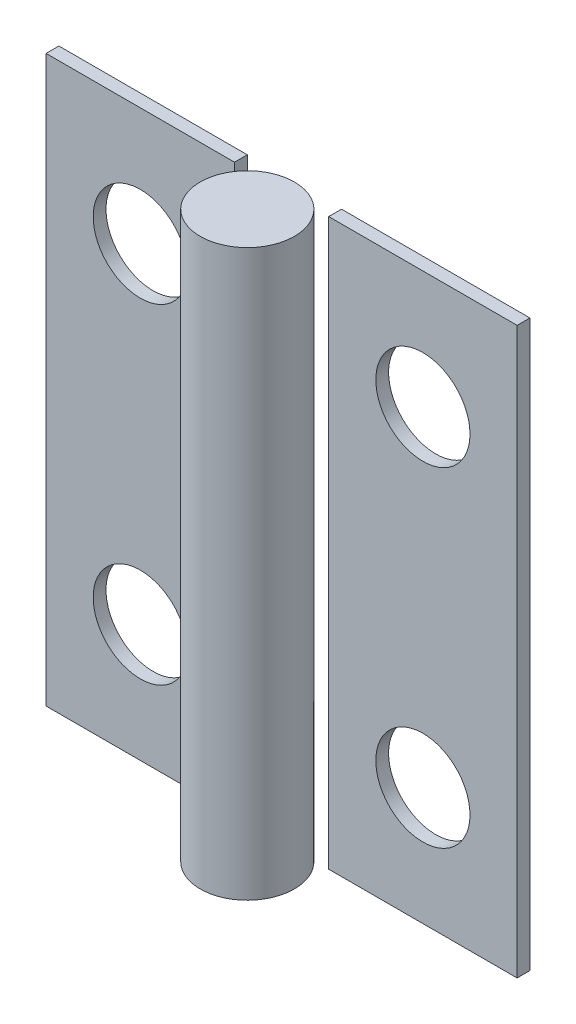
ISO-10303-21;
HEADER;
FILE_DESCRIPTION(('STEP AP214'),'2;1');
FILE_NAME('part.step','',(''),(''),'','','');
FILE_SCHEMA(('AUTOMOTIVE_DESIGN { 1 0 10303 214 1 1 1 1 }'));
ENDSEC;
DATA;
#1=APPLICATION_CONTEXT('core data for automotive mechanical design processes');
#2=APPLICATION_PROTOCOL_DEFINITION('international standard','automotive_design',2000,#1);
#3=PRODUCT_CONTEXT('',#1,'mechanical');
#4=PRODUCT('Part','Part','',(#3));
#5=PRODUCT_RELATED_PRODUCT_CATEGORY('part','',(#4));
#6=PRODUCT_DEFINITION_FORMATION('','',#4);
#7=PRODUCT_DEFINITION_CONTEXT('part definition',#1,'design');
#8=PRODUCT_DEFINITION('design','',#6,#7);
#9=PRODUCT_DEFINITION_SHAPE('','',#8);
#10=(LENGTH_UNIT() NAMED_UNIT(*) SI_UNIT(.MILLI.,.METRE.));
#11=(NAMED_UNIT(*) PLANE_ANGLE_UNIT() SI_UNIT($,.RADIAN.));
#12=(NAMED_UNIT(*) SI_UNIT($,.STERADIAN.) SOLID_ANGLE_UNIT());
#13=UNCERTAINTY_MEASURE_WITH_UNIT(LENGTH_MEASURE(1.E-05),#10,'distance_accuracy_value','');
#14=(GEOMETRIC_REPRESENTATION_CONTEXT(3) GLOBAL_UNCERTAINTY_ASSIGNED_CONTEXT((#13)) GLOBAL_UNIT_ASSIGNED_CONTEXT((#10,
#11,#12)) REPRESENTATION_CONTEXT('',''));
#15=CARTESIAN_POINT('',(0.,0.,0.));
#16=DIRECTION('',(0.,0.,1.));
#17=DIRECTION('',(1.,0.,0.));
#18=AXIS2_PLACEMENT_3D('',#15,#16,#17);
#19=CARTESIAN_POINT('',(0.,19.05,1.5875));
#20=DIRECTION('',(0.,-1.,0.));
#21=DIRECTION('',(0.,0.,-1.));
#22=AXIS2_PLACEMENT_3D('',#19,#20,#21);
#23=CYLINDRICAL_SURFACE('',#22,1.5875);
#24=CARTESIAN_POINT('',(0.,19.05,1.5875));
#25=DIRECTION('',(0.,1.,0.));
#26=DIRECTION('',(0.,0.,1.));
#27=AXIS2_PLACEMENT_3D('',#24,#25,#26);
#28=CIRCLE('',#27,1.5875);
#29=CARTESIAN_POINT('',(0.,19.05,0.));
#30=VERTEX_POINT('',#29);
#31=EDGE_CURVE('E11',#30,#30,#28,.T.);
#32=CARTESIAN_POINT('',(0.,0.,1.5875));
#33=DIRECTION('',(0.,1.,0.));
#34=DIRECTION('',(0.,0.,1.));
#35=AXIS2_PLACEMENT_3D('',#32,#33,#34);
#36=CIRCLE('',#35,1.5875);
#37=CARTESIAN_POINT('',(0.,0.,0.));
#38=VERTEX_POINT('',#37);
#39=EDGE_CURVE('E49',#38,#38,#36,.T.);
#40=CARTESIAN_POINT('',(0.,19.05,0.));
#41=CARTESIAN_POINT('',(0.,18.8515625,0.));
#42=CARTESIAN_POINT('',(0.,18.653125,0.));
#43=CARTESIAN_POINT('',(0.,18.25625,0.));
#44=CARTESIAN_POINT('',(0.,18.0578125,0.));
#45=CARTESIAN_POINT('',(0.,17.6609375,0.));
#46=CARTESIAN_POINT('',(0.,17.4625,0.));
#47=CARTESIAN_POINT('',(0.,17.065625,0.));
#48=CARTESIAN_POINT('',(0.,16.8671875,0.));
#49=CARTESIAN_POINT('',(0.,16.4703125,0.));
#50=CARTESIAN_POINT('',(0.,16.271875,0.));
#51=CARTESIAN_POINT('',(0.,15.875,0.));
#52=CARTESIAN_POINT('',(0.,15.6765625,0.));
#53=CARTESIAN_POINT('',(0.,15.2796875,0.));
#54=CARTESIAN_POINT('',(0.,15.08125,0.));
#55=CARTESIAN_POINT('',(0.,14.684375,0.));
#56=CARTESIAN_POINT('',(0.,14.4859375,0.));
#57=CARTESIAN_POINT('',(0.,14.0890625,0.));
#58=CARTESIAN_POINT('',(0.,13.890625,0.));
#59=CARTESIAN_POINT('',(0.,13.49375,0.));
#60=CARTESIAN_POINT('',(0.,13.2953125,0.));
#61=CARTESIAN_POINT('',(0.,12.8984375,0.));
#62=CARTESIAN_POINT('',(0.,12.7,0.));
#63=CARTESIAN_POINT('',(0.,12.303125,0.));
#64=CARTESIAN_POINT('',(0.,12.1046875,0.));
#65=CARTESIAN_POINT('',(0.,11.7078125,0.));
#66=CARTESIAN_POINT('',(0.,11.509375,0.));
#67=CARTESIAN_POINT('',(0.,11.1125,0.));
#68=CARTESIAN_POINT('',(0.,10.9140625,0.));
#69=CARTESIAN_POINT('',(0.,10.5171875,0.));
#70=CARTESIAN_POINT('',(0.,10.31875,0.));
#71=CARTESIAN_POINT('',(0.,9.921875,0.));
#72=CARTESIAN_POINT('',(0.,9.7234375,0.));
#73=CARTESIAN_POINT('',(0.,9.3265625,0.));
#74=CARTESIAN_POINT('',(0.,9.128125,0.));
#75=CARTESIAN_POINT('',(0.,8.73125,0.));
#76=CARTESIAN_POINT('',(0.,8.5328125,0.));
#77=CARTESIAN_POINT('',(0.,8.1359375,0.));
#78=CARTESIAN_POINT('',(0.,7.9375,0.));
#79=CARTESIAN_POINT('',(0.,7.540625,0.));
#80=CARTESIAN_POINT('',(0.,7.3421875,0.));
#81=CARTESIAN_POINT('',(0.,6.9453125,0.));
#82=CARTESIAN_POINT('',(0.,6.746875,0.));
#83=CARTESIAN_POINT('',(0.,6.35,0.));
#84=CARTESIAN_POINT('',(0.,6.1515625,0.));
#85=CARTESIAN_POINT('',(0.,5.7546875,0.));
#86=CARTESIAN_POINT('',(0.,5.55625,0.));
#87=CARTESIAN_POINT('',(0.,5.159375,0.));
#88=CARTESIAN_POINT('',(0.,4.9609375,0.));
#89=CARTESIAN_POINT('',(0.,4.5640625,0.));
#90=CARTESIAN_POINT('',(0.,4.365625,0.));
#91=CARTESIAN_POINT('',(0.,3.96875,0.));
#92=CARTESIAN_POINT('',(0.,3.7703125,0.));
#93=CARTESIAN_POINT('',(0.,3.3734375,0.));
#94=CARTESIAN_POINT('',(0.,3.175,0.));
#95=CARTESIAN_POINT('',(0.,2.778125,0.));
#96=CARTESIAN_POINT('',(0.,2.5796875,0.));
#97=CARTESIAN_POINT('',(0.,2.1828125,0.));
#98=CARTESIAN_POINT('',(0.,1.984375,0.));
#99=CARTESIAN_POINT('',(0.,1.5875,0.));
#100=CARTESIAN_POINT('',(0.,1.3890625,0.));
#101=CARTESIAN_POINT('',(0.,0.992187500000001,0.));
#102=CARTESIAN_POINT('',(0.,0.793750000000001,0.));
#103=CARTESIAN_POINT('',(0.,0.396875,0.));
#104=CARTESIAN_POINT('',(0.,0.1984375,0.));
#105=CARTESIAN_POINT('',(0.,0.,0.));
#106=B_SPLINE_CURVE_WITH_KNOTS('',3,(#40,#41,#42,#43,#44,#45,#46,#47,#48,#49,#50,#51,#52,#53,
#54,#55,#56,#57,#58,#59,#60,#61,#62,#63,#64,#65,#66,#67,#68,#69,#70,#71,#72,#73,#74,#75,#76,#77,
#78,#79,#80,#81,#82,#83,#84,#85,#86,#87,#88,#89,#90,#91,#92,#93,#94,#95,#96,#97,#98,#99,#100,
#101,#102,#103,#104,#105),.UNSPECIFIED.,.F.,.F.,(4,2,2,2,2,2,2,2,2,2,2,2,2,2,2,2,2,2,2,2,2,2,2,
2,2,2,2,2,2,2,2,2,4),(0.,0.595312499999997,1.190625,1.7859375,2.38125,2.9765625,3.571875,
4.1671875,4.7625,5.3578125,5.953125,6.5484375,7.14375,7.7390625,8.334375,8.9296875,9.525,
10.1203125,10.715625,11.3109375,11.90625,12.5015625,13.096875,13.6921875,14.2875,14.8828125,
15.478125,16.0734375,16.66875,17.2640625,17.859375,18.4546875,19.05),.UNSPECIFIED.);
#107=EDGE_CURVE('BSEAM46',#30,#38,#106,.T.);
#108=ORIENTED_EDGE('',*,*,#31,.F.);
#109=ORIENTED_EDGE('',*,*,#39,.T.);
#110=ORIENTED_EDGE('',*,*,#107,.T.);
#111=ORIENTED_EDGE('',*,*,#107,.F.);
#112=EDGE_LOOP('',(#108,#110,#109,#111));
#113=FACE_BOUND('',#112,.T.);
#114=ADVANCED_FACE('F46',(#113),#23,.T.);
#115=CARTESIAN_POINT('',(0.,19.05,1.5875));
#116=DIRECTION('',(0.,1.,0.));
#117=DIRECTION('',(0.,0.,1.));
#118=AXIS2_PLACEMENT_3D('',#115,#116,#117);
#119=PLANE('',#118);
#120=ORIENTED_EDGE('',*,*,#31,.T.);
#121=EDGE_LOOP('',(#120));
#122=FACE_BOUND('',#121,.T.);
#123=ADVANCED_FACE('F61',(#122),#119,.T.);
#124=CARTESIAN_POINT('',(0.,0.,1.5875));
#125=DIRECTION('',(0.,1.,0.));
#126=DIRECTION('',(0.,0.,1.));
#127=AXIS2_PLACEMENT_3D('',#124,#125,#126);
#128=PLANE('',#127);
#129=ORIENTED_EDGE('',*,*,#39,.F.);
#130=EDGE_LOOP('',(#129));
#131=FACE_BOUND('',#130,.T.);
#132=ADVANCED_FACE('F59',(#131),#128,.F.);
#133=CLOSED_SHELL('',(#114,#123,#132));
#134=MANIFOLD_SOLID_BREP('B2',#133);
#135=CARTESIAN_POINT('',(0.,0.,0.4318));
#136=DIRECTION('',(0.,0.,1.));
#137=DIRECTION('',(1.,0.,0.));
#138=AXIS2_PLACEMENT_3D('',#135,#136,#137);
#139=PLANE('',#138);
#140=CARTESIAN_POINT('',(4.7625,3.96875,0.4318));
#141=DIRECTION('',(0.,0.,1.));
#142=DIRECTION('',(1.,0.,0.));
#143=AXIS2_PLACEMENT_3D('',#140,#141,#142);
#144=CIRCLE('',#143,1.5875);
#145=CARTESIAN_POINT('',(6.35,3.96875,0.4318));
#146=VERTEX_POINT('',#145);
#147=EDGE_CURVE('E163',#146,#146,#144,.T.);
#148=ORIENTED_EDGE('',*,*,#147,.F.);
#149=EDGE_LOOP('',(#148));
#150=FACE_BOUND('',#149,.T.);
#151=DIRECTION('',(0.,1.,0.));
#152=VECTOR('',#151,1.);
#153=CARTESIAN_POINT('',(7.9375,19.05,0.4318));
#154=LINE('',#153,#152);
#155=CARTESIAN_POINT('',(7.9375,0.,0.4318));
#156=VERTEX_POINT('',#155);
#157=CARTESIAN_POINT('',(7.9375,19.05,0.4318));
#158=VERTEX_POINT('',#157);
#159=EDGE_CURVE('E148',#156,#158,#154,.T.);
#160=ORIENTED_EDGE('',*,*,#159,.T.);
#161=DIRECTION('',(-1.,0.,0.));
#162=VECTOR('',#161,1.);
#163=CARTESIAN_POINT('',(1.5875,19.05,0.4318));
#164=LINE('',#163,#162);
#165=CARTESIAN_POINT('',(1.5875,19.05,0.4318));
#166=VERTEX_POINT('',#165);
#167=EDGE_CURVE('E143',#158,#166,#164,.T.);
#168=ORIENTED_EDGE('',*,*,#167,.T.);
#169=DIRECTION('',(0.,-1.,0.));
#170=VECTOR('',#169,1.);
#171=CARTESIAN_POINT('',(1.5875,19.05,0.4318));
#172=LINE('',#171,#170);
#173=CARTESIAN_POINT('',(1.5875,0.,0.4318));
#174=VERTEX_POINT('',#173);
#175=EDGE_CURVE('E146',#166,#174,#172,.T.);
#176=ORIENTED_EDGE('',*,*,#175,.T.);
#177=DIRECTION('',(1.,0.,0.));
#178=VECTOR('',#177,1.);
#179=CARTESIAN_POINT('',(1.5875,0.,0.4318));
#180=LINE('',#179,#178);
#181=EDGE_CURVE('E113',#174,#156,#180,.T.);
#182=ORIENTED_EDGE('',*,*,#181,.T.);
#183=EDGE_LOOP('',(#160,#168,#176,#182));
#184=FACE_BOUND('',#183,.T.);
#185=CARTESIAN_POINT('',(4.7625,15.08125,0.4318));
#186=DIRECTION('',(0.,0.,1.));
#187=DIRECTION('',(1.,0.,0.));
#188=AXIS2_PLACEMENT_3D('',#185,#186,#187);
#189=CIRCLE('',#188,1.5875);
#190=CARTESIAN_POINT('',(6.35,15.08125,0.4318));
#191=VERTEX_POINT('',#190);
#192=EDGE_CURVE('E178',#191,#191,#189,.T.);
#193=ORIENTED_EDGE('',*,*,#192,.F.);
#194=EDGE_LOOP('',(#193));
#195=FACE_BOUND('',#194,.T.);
#196=ADVANCED_FACE('F96',(#150,#184,#195),#139,.T.);
#197=CARTESIAN_POINT('',(0.,0.,0.));
#198=DIRECTION('',(0.,0.,1.));
#199=DIRECTION('',(1.,0.,0.));
#200=AXIS2_PLACEMENT_3D('',#197,#198,#199);
#201=PLANE('',#200);
#202=DIRECTION('',(0.,1.,0.));
#203=VECTOR('',#202,1.);
#204=CARTESIAN_POINT('',(7.9375,19.05,0.));
#205=LINE('',#204,#203);
#206=CARTESIAN_POINT('',(7.9375,0.,0.));
#207=VERTEX_POINT('',#206);
#208=CARTESIAN_POINT('',(7.9375,19.05,0.));
#209=VERTEX_POINT('',#208);
#210=EDGE_CURVE('E160',#207,#209,#205,.T.);
#211=ORIENTED_EDGE('',*,*,#210,.F.);
#212=DIRECTION('',(1.,0.,0.));
#213=VECTOR('',#212,1.);
#214=CARTESIAN_POINT('',(1.5875,0.,0.));
#215=LINE('',#214,#213);
#216=CARTESIAN_POINT('',(1.5875,0.,0.));
#217=VERTEX_POINT('',#216);
#218=EDGE_CURVE('E136',#217,#207,#215,.T.);
#219=ORIENTED_EDGE('',*,*,#218,.F.);
#220=DIRECTION('',(0.,-1.,0.));
#221=VECTOR('',#220,1.);
#222=CARTESIAN_POINT('',(1.5875,19.05,0.));
#223=LINE('',#222,#221);
#224=CARTESIAN_POINT('',(1.5875,19.05,0.));
#225=VERTEX_POINT('',#224);
#226=EDGE_CURVE('E130',#225,#217,#223,.T.);
#227=ORIENTED_EDGE('',*,*,#226,.F.);
#228=DIRECTION('',(-1.,0.,0.));
#229=VECTOR('',#228,1.);
#230=CARTESIAN_POINT('',(1.5875,19.05,0.));
#231=LINE('',#230,#229);
#232=EDGE_CURVE('E152',#209,#225,#231,.T.);
#233=ORIENTED_EDGE('',*,*,#232,.F.);
#234=EDGE_LOOP('',(#211,#219,#227,#233));
#235=FACE_BOUND('',#234,.T.);
#236=CARTESIAN_POINT('',(4.7625,3.96875,0.));
#237=DIRECTION('',(0.,0.,1.));
#238=DIRECTION('',(1.,0.,0.));
#239=AXIS2_PLACEMENT_3D('',#236,#237,#238);
#240=CIRCLE('',#239,1.5875);
#241=CARTESIAN_POINT('',(6.35,3.96875,0.));
#242=VERTEX_POINT('',#241);
#243=EDGE_CURVE('E175',#242,#242,#240,.T.);
#244=ORIENTED_EDGE('',*,*,#243,.T.);
#245=EDGE_LOOP('',(#244));
#246=FACE_BOUND('',#245,.T.);
#247=CARTESIAN_POINT('',(4.7625,15.08125,0.));
#248=DIRECTION('',(0.,0.,1.));
#249=DIRECTION('',(1.,0.,0.));
#250=AXIS2_PLACEMENT_3D('',#247,#248,#249);
#251=CIRCLE('',#250,1.5875);
#252=CARTESIAN_POINT('',(6.35,15.08125,0.));
#253=VERTEX_POINT('',#252);
#254=EDGE_CURVE('E181',#253,#253,#251,.T.);
#255=ORIENTED_EDGE('',*,*,#254,.T.);
#256=EDGE_LOOP('',(#255));
#257=FACE_BOUND('',#256,.T.);
#258=ADVANCED_FACE('F171',(#235,#246,#257),#201,.F.);
#259=CARTESIAN_POINT('',(7.9375,19.05,0.4318));
#260=DIRECTION('',(-1.,0.,0.));
#261=DIRECTION('',(0.,-1.,0.));
#262=AXIS2_PLACEMENT_3D('',#259,#260,#261);
#263=PLANE('',#262);
#264=ORIENTED_EDGE('',*,*,#210,.T.);
#265=DIRECTION('',(0.,0.,-1.));
#266=VECTOR('',#265,1.);
#267=CARTESIAN_POINT('',(7.9375,19.05,0.4318));
#268=LINE('',#267,#266);
#269=EDGE_CURVE('E44',#158,#209,#268,.T.);
#270=ORIENTED_EDGE('',*,*,#269,.F.);
#271=ORIENTED_EDGE('',*,*,#159,.F.);
#272=DIRECTION('',(0.,0.,-1.));
#273=VECTOR('',#272,1.);
#274=CARTESIAN_POINT('',(7.9375,0.,0.4318));
#275=LINE('',#274,#273);
#276=EDGE_CURVE('E156',#156,#207,#275,.T.);
#277=ORIENTED_EDGE('',*,*,#276,.T.);
#278=EDGE_LOOP('',(#264,#270,#271,#277));
#279=FACE_BOUND('',#278,.T.);
#280=ADVANCED_FACE('F98',(#279),#263,.F.);
#281=CARTESIAN_POINT('',(1.5875,19.05,0.4318));
#282=DIRECTION('',(0.,-1.,0.));
#283=DIRECTION('',(0.,0.,-1.));
#284=AXIS2_PLACEMENT_3D('',#281,#282,#283);
#285=PLANE('',#284);
#286=ORIENTED_EDGE('',*,*,#232,.T.);
#287=DIRECTION('',(0.,0.,-1.));
#288=VECTOR('',#287,1.);
#289=CARTESIAN_POINT('',(1.5875,19.05,0.4318));
#290=LINE('',#289,#288);
#291=EDGE_CURVE('E105',#166,#225,#290,.T.);
#292=ORIENTED_EDGE('',*,*,#291,.F.);
#293=ORIENTED_EDGE('',*,*,#167,.F.);
#294=ORIENTED_EDGE('',*,*,#269,.T.);
#295=EDGE_LOOP('',(#286,#292,#293,#294));
#296=FACE_BOUND('',#295,.T.);
#297=ADVANCED_FACE('F151',(#296),#285,.F.);
#298=CARTESIAN_POINT('',(1.5875,19.05,0.4318));
#299=DIRECTION('',(1.,0.,0.));
#300=DIRECTION('',(0.,0.,-1.));
#301=AXIS2_PLACEMENT_3D('',#298,#299,#300);
#302=PLANE('',#301);
#303=ORIENTED_EDGE('',*,*,#226,.T.);
#304=DIRECTION('',(0.,0.,-1.));
#305=VECTOR('',#304,1.);
#306=CARTESIAN_POINT('',(1.5875,0.,0.4318));
#307=LINE('',#306,#305);
#308=EDGE_CURVE('E153',#174,#217,#307,.T.);
#309=ORIENTED_EDGE('',*,*,#308,.F.);
#310=ORIENTED_EDGE('',*,*,#175,.F.);
#311=ORIENTED_EDGE('',*,*,#291,.T.);
#312=EDGE_LOOP('',(#303,#309,#310,#311));
#313=FACE_BOUND('',#312,.T.);
#314=ADVANCED_FACE('F154',(#313),#302,.F.);
#315=CARTESIAN_POINT('',(1.5875,0.,0.4318));
#316=DIRECTION('',(0.,1.,0.));
#317=DIRECTION('',(-1.,0.,0.));
#318=AXIS2_PLACEMENT_3D('',#315,#316,#317);
#319=PLANE('',#318);
#320=ORIENTED_EDGE('',*,*,#218,.T.);
#321=ORIENTED_EDGE('',*,*,#276,.F.);
#322=ORIENTED_EDGE('',*,*,#181,.F.);
#323=ORIENTED_EDGE('',*,*,#308,.T.);
#324=EDGE_LOOP('',(#320,#321,#322,#323));
#325=FACE_BOUND('',#324,.T.);
#326=ADVANCED_FACE('F168',(#325),#319,.F.);
#327=CARTESIAN_POINT('',(4.7625,3.96875,0.4318));
#328=DIRECTION('',(0.,0.,-1.));
#329=DIRECTION('',(-1.,0.,0.));
#330=AXIS2_PLACEMENT_3D('',#327,#328,#329);
#331=CYLINDRICAL_SURFACE('',#330,1.5875);
#332=ORIENTED_EDGE('',*,*,#147,.T.);
#333=EDGE_LOOP('',(#332));
#334=FACE_BOUND('',#333,.T.);
#335=ORIENTED_EDGE('',*,*,#243,.F.);
#336=EDGE_LOOP('',(#335));
#337=FACE_BOUND('',#336,.T.);
#338=ADVANCED_FACE('F198',(#334,#337),#331,.F.);
#339=CARTESIAN_POINT('',(4.7625,15.08125,0.4318));
#340=DIRECTION('',(0.,0.,-1.));
#341=DIRECTION('',(-1.,0.,0.));
#342=AXIS2_PLACEMENT_3D('',#339,#340,#341);
#343=CYLINDRICAL_SURFACE('',#342,1.5875);
#344=ORIENTED_EDGE('',*,*,#192,.T.);
#345=EDGE_LOOP('',(#344));
#346=FACE_BOUND('',#345,.T.);
#347=ORIENTED_EDGE('',*,*,#254,.F.);
#348=EDGE_LOOP('',(#347));
#349=FACE_BOUND('',#348,.T.);
#350=ADVANCED_FACE('F187',(#346,#349),#343,.F.);
#351=CLOSED_SHELL('',(#196,#258,#280,#297,#314,#326,#338,#350));
#352=MANIFOLD_SOLID_BREP('B6',#351);
#353=CARTESIAN_POINT('',(0.,0.,0.4318));
#354=DIRECTION('',(0.,0.,-1.));
#355=DIRECTION('',(-1.,0.,0.));
#356=AXIS2_PLACEMENT_3D('',#353,#354,#355);
#357=PLANE('',#356);
#358=DIRECTION('',(0.,-1.,0.));
#359=VECTOR('',#358,1.);
#360=CARTESIAN_POINT('',(-7.93750000000001,0.,0.4318));
#361=LINE('',#360,#359);
#362=CARTESIAN_POINT('',(-7.9375,19.05,0.4318));
#363=VERTEX_POINT('',#362);
#364=CARTESIAN_POINT('',(-7.93750000000001,0.,0.4318));
#365=VERTEX_POINT('',#364);
#366=EDGE_CURVE('E314',#363,#365,#361,.T.);
#367=ORIENTED_EDGE('',*,*,#366,.T.);
#368=DIRECTION('',(1.,0.,0.));
#369=VECTOR('',#368,1.);
#370=CARTESIAN_POINT('',(-7.93750000000001,0.,0.4318));
#371=LINE('',#370,#369);
#372=CARTESIAN_POINT('',(-1.5875,0.,0.4318));
#373=VERTEX_POINT('',#372);
#374=EDGE_CURVE('E309',#365,#373,#371,.T.);
#375=ORIENTED_EDGE('',*,*,#374,.T.);
#376=DIRECTION('',(0.,1.,0.));
#377=VECTOR('',#376,1.);
#378=CARTESIAN_POINT('',(-1.5875,0.,0.4318));
#379=LINE('',#378,#377);
#380=CARTESIAN_POINT('',(-1.5875,19.05,0.4318));
#381=VERTEX_POINT('',#380);
#382=EDGE_CURVE('E312',#373,#381,#379,.T.);
#383=ORIENTED_EDGE('',*,*,#382,.T.);
#384=DIRECTION('',(-1.,0.,0.));
#385=VECTOR('',#384,1.);
#386=CARTESIAN_POINT('',(-7.9375,19.05,0.4318));
#387=LINE('',#386,#385);
#388=EDGE_CURVE('E279',#381,#363,#387,.T.);
#389=ORIENTED_EDGE('',*,*,#388,.T.);
#390=EDGE_LOOP('',(#367,#375,#383,#389));
#391=FACE_BOUND('',#390,.T.);
#392=CARTESIAN_POINT('',(-4.7625,15.08125,0.4318));
#393=DIRECTION('',(0.,0.,1.));
#394=DIRECTION('',(1.,0.,0.));
#395=AXIS2_PLACEMENT_3D('',#392,#393,#394);
#396=CIRCLE('',#395,1.5875);
#397=CARTESIAN_POINT('',(-3.175,15.08125,0.4318));
#398=VERTEX_POINT('',#397);
#399=EDGE_CURVE('E329',#398,#398,#396,.T.);
#400=ORIENTED_EDGE('',*,*,#399,.F.);
#401=EDGE_LOOP('',(#400));
#402=FACE_BOUND('',#401,.T.);
#403=CARTESIAN_POINT('',(-4.7625,3.96875,0.4318));
#404=DIRECTION('',(0.,0.,1.));
#405=DIRECTION('',(1.,0.,0.));
#406=AXIS2_PLACEMENT_3D('',#403,#404,#405);
#407=CIRCLE('',#406,1.5875);
#408=CARTESIAN_POINT('',(-3.175,3.96875,0.4318));
#409=VERTEX_POINT('',#408);
#410=EDGE_CURVE('E344',#409,#409,#407,.T.);
#411=ORIENTED_EDGE('',*,*,#410,.F.);
#412=EDGE_LOOP('',(#411));
#413=FACE_BOUND('',#412,.T.);
#414=ADVANCED_FACE('F262',(#391,#402,#413),#357,.F.);
#415=CARTESIAN_POINT('',(0.,0.,0.));
#416=DIRECTION('',(0.,0.,-1.));
#417=DIRECTION('',(-1.,0.,0.));
#418=AXIS2_PLACEMENT_3D('',#415,#416,#417);
#419=PLANE('',#418);
#420=CARTESIAN_POINT('',(-4.7625,15.08125,0.));
#421=DIRECTION('',(0.,0.,1.));
#422=DIRECTION('',(1.,0.,0.));
#423=AXIS2_PLACEMENT_3D('',#420,#421,#422);
#424=CIRCLE('',#423,1.5875);
#425=CARTESIAN_POINT('',(-3.175,15.08125,0.));
#426=VERTEX_POINT('',#425);
#427=EDGE_CURVE('E341',#426,#426,#424,.T.);
#428=ORIENTED_EDGE('',*,*,#427,.T.);
#429=EDGE_LOOP('',(#428));
#430=FACE_BOUND('',#429,.T.);
#431=DIRECTION('',(0.,-1.,0.));
#432=VECTOR('',#431,1.);
#433=CARTESIAN_POINT('',(-7.93750000000001,0.,0.));
#434=LINE('',#433,#432);
#435=CARTESIAN_POINT('',(-7.9375,19.05,0.));
#436=VERTEX_POINT('',#435);
#437=CARTESIAN_POINT('',(-7.93750000000001,0.,0.));
#438=VERTEX_POINT('',#437);
#439=EDGE_CURVE('E326',#436,#438,#434,.T.);
#440=ORIENTED_EDGE('',*,*,#439,.F.);
#441=DIRECTION('',(-1.,0.,0.));
#442=VECTOR('',#441,1.);
#443=CARTESIAN_POINT('',(-7.9375,19.05,0.));
#444=LINE('',#443,#442);
#445=CARTESIAN_POINT('',(-1.5875,19.05,0.));
#446=VERTEX_POINT('',#445);
#447=EDGE_CURVE('E302',#446,#436,#444,.T.);
#448=ORIENTED_EDGE('',*,*,#447,.F.);
#449=DIRECTION('',(0.,1.,0.));
#450=VECTOR('',#449,1.);
#451=CARTESIAN_POINT('',(-1.5875,0.,0.));
#452=LINE('',#451,#450);
#453=CARTESIAN_POINT('',(-1.5875,0.,0.));
#454=VERTEX_POINT('',#453);
#455=EDGE_CURVE('E296',#454,#446,#452,.T.);
#456=ORIENTED_EDGE('',*,*,#455,.F.);
#457=DIRECTION('',(1.,0.,0.));
#458=VECTOR('',#457,1.);
#459=CARTESIAN_POINT('',(-7.93750000000001,0.,0.));
#460=LINE('',#459,#458);
#461=EDGE_CURVE('E318',#438,#454,#460,.T.);
#462=ORIENTED_EDGE('',*,*,#461,.F.);
#463=EDGE_LOOP('',(#440,#448,#456,#462));
#464=FACE_BOUND('',#463,.T.);
#465=CARTESIAN_POINT('',(-4.7625,3.96875,0.));
#466=DIRECTION('',(0.,0.,1.));
#467=DIRECTION('',(1.,0.,0.));
#468=AXIS2_PLACEMENT_3D('',#465,#466,#467);
#469=CIRCLE('',#468,1.5875);
#470=CARTESIAN_POINT('',(-3.175,3.96875,0.));
#471=VERTEX_POINT('',#470);
#472=EDGE_CURVE('E347',#471,#471,#469,.T.);
#473=ORIENTED_EDGE('',*,*,#472,.T.);
#474=EDGE_LOOP('',(#473));
#475=FACE_BOUND('',#474,.T.);
#476=ADVANCED_FACE('F337',(#430,#464,#475),#419,.T.);
#477=CARTESIAN_POINT('',(-7.93750000000001,0.,0.4318));
#478=DIRECTION('',(1.,0.,0.));
#479=DIRECTION('',(0.,1.,0.));
#480=AXIS2_PLACEMENT_3D('',#477,#478,#479);
#481=PLANE('',#480);
#482=ORIENTED_EDGE('',*,*,#439,.T.);
#483=DIRECTION('',(0.,0.,-1.));
#484=VECTOR('',#483,1.);
#485=CARTESIAN_POINT('',(-7.93750000000001,0.,0.4318));
#486=LINE('',#485,#484);
#487=EDGE_CURVE('E94',#365,#438,#486,.T.);
#488=ORIENTED_EDGE('',*,*,#487,.F.);
#489=ORIENTED_EDGE('',*,*,#366,.F.);
#490=DIRECTION('',(0.,0.,-1.));
#491=VECTOR('',#490,1.);
#492=CARTESIAN_POINT('',(-7.9375,19.05,0.4318));
#493=LINE('',#492,#491);
#494=EDGE_CURVE('E322',#363,#436,#493,.T.);
#495=ORIENTED_EDGE('',*,*,#494,.T.);
#496=EDGE_LOOP('',(#482,#488,#489,#495));
#497=FACE_BOUND('',#496,.T.);
#498=ADVANCED_FACE('F264',(#497),#481,.F.);
#499=CARTESIAN_POINT('',(-7.93750000000001,0.,0.4318));
#500=DIRECTION('',(0.,1.,0.));
#501=DIRECTION('',(-1.,0.,0.));
#502=AXIS2_PLACEMENT_3D('',#499,#500,#501);
#503=PLANE('',#502);
#504=ORIENTED_EDGE('',*,*,#461,.T.);
#505=DIRECTION('',(0.,0.,-1.));
#506=VECTOR('',#505,1.);
#507=CARTESIAN_POINT('',(-1.5875,0.,0.4318));
#508=LINE('',#507,#506);
#509=EDGE_CURVE('E271',#373,#454,#508,.T.);
#510=ORIENTED_EDGE('',*,*,#509,.F.);
#511=ORIENTED_EDGE('',*,*,#374,.F.);
#512=ORIENTED_EDGE('',*,*,#487,.T.);
#513=EDGE_LOOP('',(#504,#510,#511,#512));
#514=FACE_BOUND('',#513,.T.);
#515=ADVANCED_FACE('F317',(#514),#503,.F.);
#516=CARTESIAN_POINT('',(-1.5875,0.,0.4318));
#517=DIRECTION('',(-1.,0.,0.));
#518=DIRECTION('',(0.,-1.,0.));
#519=AXIS2_PLACEMENT_3D('',#516,#517,#518);
#520=PLANE('',#519);
#521=ORIENTED_EDGE('',*,*,#455,.T.);
#522=DIRECTION('',(0.,0.,-1.));
#523=VECTOR('',#522,1.);
#524=CARTESIAN_POINT('',(-1.5875,19.05,0.4318));
#525=LINE('',#524,#523);
#526=EDGE_CURVE('E319',#381,#446,#525,.T.);
#527=ORIENTED_EDGE('',*,*,#526,.F.);
#528=ORIENTED_EDGE('',*,*,#382,.F.);
#529=ORIENTED_EDGE('',*,*,#509,.T.);
#530=EDGE_LOOP('',(#521,#527,#528,#529));
#531=FACE_BOUND('',#530,.T.);
#532=ADVANCED_FACE('F320',(#531),#520,.F.);
#533=CARTESIAN_POINT('',(-7.9375,19.05,0.4318));
#534=DIRECTION('',(0.,-1.,0.));
#535=DIRECTION('',(1.,0.,0.));
#536=AXIS2_PLACEMENT_3D('',#533,#534,#535);
#537=PLANE('',#536);
#538=ORIENTED_EDGE('',*,*,#447,.T.);
#539=ORIENTED_EDGE('',*,*,#494,.F.);
#540=ORIENTED_EDGE('',*,*,#388,.F.);
#541=ORIENTED_EDGE('',*,*,#526,.T.);
#542=EDGE_LOOP('',(#538,#539,#540,#541));
#543=FACE_BOUND('',#542,.T.);
#544=ADVANCED_FACE('F334',(#543),#537,.F.);
#545=CARTESIAN_POINT('',(-4.7625,15.08125,0.4318));
#546=DIRECTION('',(0.,0.,-1.));
#547=DIRECTION('',(-1.,0.,0.));
#548=AXIS2_PLACEMENT_3D('',#545,#546,#547);
#549=CYLINDRICAL_SURFACE('',#548,1.5875);
#550=ORIENTED_EDGE('',*,*,#399,.T.);
#551=EDGE_LOOP('',(#550));
#552=FACE_BOUND('',#551,.T.);
#553=ORIENTED_EDGE('',*,*,#427,.F.);
#554=EDGE_LOOP('',(#553));
#555=FACE_BOUND('',#554,.T.);
#556=ADVANCED_FACE('F364',(#552,#555),#549,.F.);
#557=CARTESIAN_POINT('',(-4.7625,3.96875,0.4318));
#558=DIRECTION('',(0.,0.,-1.));
#559=DIRECTION('',(-1.,0.,0.));
#560=AXIS2_PLACEMENT_3D('',#557,#558,#559);
#561=CYLINDRICAL_SURFACE('',#560,1.5875);
#562=ORIENTED_EDGE('',*,*,#410,.T.);
#563=EDGE_LOOP('',(#562));
#564=FACE_BOUND('',#563,.T.);
#565=ORIENTED_EDGE('',*,*,#472,.F.);
#566=EDGE_LOOP('',(#565));
#567=FACE_BOUND('',#566,.T.);
#568=ADVANCED_FACE('F353',(#564,#567),#561,.F.);
#569=CLOSED_SHELL('',(#414,#476,#498,#515,#532,#544,#556,#568));
#570=MANIFOLD_SOLID_BREP('B38',#569);
#571=ADVANCED_BREP_SHAPE_REPRESENTATION('',(#18,#134,#352,#570),#14);
#572=SHAPE_DEFINITION_REPRESENTATION(#9,#571);
ENDSEC;
END-ISO-10303-21;
